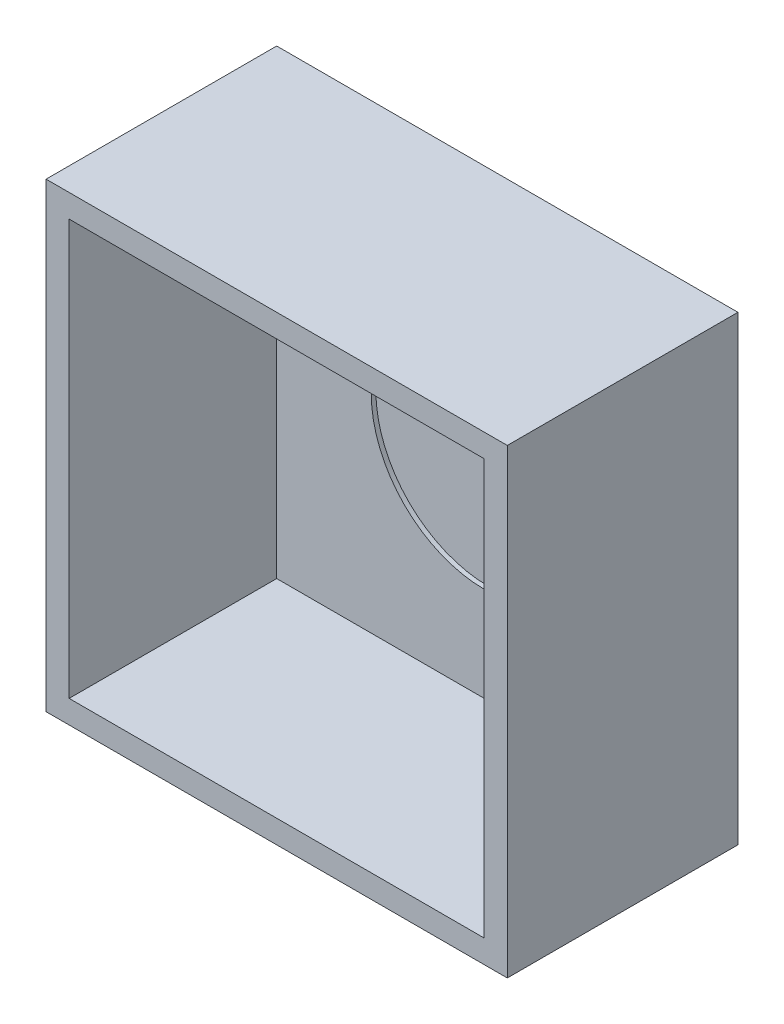
ISO-10303-21;
HEADER;
FILE_DESCRIPTION(('STEP AP214'),'2;1');
FILE_NAME('part.step','',(''),(''),'','','');
FILE_SCHEMA(('AUTOMOTIVE_DESIGN { 1 0 10303 214 1 1 1 1 }'));
ENDSEC;
DATA;
#1=APPLICATION_CONTEXT('core data for automotive mechanical design processes');
#2=APPLICATION_PROTOCOL_DEFINITION('international standard','automotive_design',2000,#1);
#3=PRODUCT_CONTEXT('',#1,'mechanical');
#4=PRODUCT('Part','Part','',(#3));
#5=PRODUCT_RELATED_PRODUCT_CATEGORY('part','',(#4));
#6=PRODUCT_DEFINITION_FORMATION('','',#4);
#7=PRODUCT_DEFINITION_CONTEXT('part definition',#1,'design');
#8=PRODUCT_DEFINITION('design','',#6,#7);
#9=PRODUCT_DEFINITION_SHAPE('','',#8);
#10=(LENGTH_UNIT() NAMED_UNIT(*) SI_UNIT(.MILLI.,.METRE.));
#11=(NAMED_UNIT(*) PLANE_ANGLE_UNIT() SI_UNIT($,.RADIAN.));
#12=(NAMED_UNIT(*) SI_UNIT($,.STERADIAN.) SOLID_ANGLE_UNIT());
#13=UNCERTAINTY_MEASURE_WITH_UNIT(LENGTH_MEASURE(1.E-05),#10,'distance_accuracy_value','');
#14=(GEOMETRIC_REPRESENTATION_CONTEXT(3) GLOBAL_UNCERTAINTY_ASSIGNED_CONTEXT((#13)) GLOBAL_UNIT_ASSIGNED_CONTEXT((#10,
#11,#12)) REPRESENTATION_CONTEXT('',''));
#15=CARTESIAN_POINT('',(0.,0.,0.));
#16=DIRECTION('',(0.,0.,1.));
#17=DIRECTION('',(1.,0.,0.));
#18=AXIS2_PLACEMENT_3D('',#15,#16,#17);
#19=CARTESIAN_POINT('',(0.,0.,10.));
#20=DIRECTION('',(0.,0.,-1.));
#21=DIRECTION('',(-1.,0.,0.));
#22=AXIS2_PLACEMENT_3D('',#19,#20,#21);
#23=PLANE('',#22);
#24=DIRECTION('',(0.,1.,0.));
#25=VECTOR('',#24,1.);
#26=CARTESIAN_POINT('',(10.,-10.,10.));
#27=LINE('',#26,#25);
#28=CARTESIAN_POINT('',(10.,-10.,10.));
#29=VERTEX_POINT('',#28);
#30=CARTESIAN_POINT('',(10.,10.,10.));
#31=VERTEX_POINT('',#30);
#32=EDGE_CURVE('E144',#29,#31,#27,.T.);
#33=ORIENTED_EDGE('',*,*,#32,.T.);
#34=DIRECTION('',(-1.,0.,0.));
#35=VECTOR('',#34,1.);
#36=CARTESIAN_POINT('',(-10.,10.,10.));
#37=LINE('',#36,#35);
#38=CARTESIAN_POINT('',(-10.,10.,10.));
#39=VERTEX_POINT('',#38);
#40=EDGE_CURVE('E88',#31,#39,#37,.T.);
#41=ORIENTED_EDGE('',*,*,#40,.T.);
#42=DIRECTION('',(0.,-1.,0.));
#43=VECTOR('',#42,1.);
#44=CARTESIAN_POINT('',(-10.,-10.,10.));
#45=LINE('',#44,#43);
#46=CARTESIAN_POINT('',(-10.,-10.,10.));
#47=VERTEX_POINT('',#46);
#48=EDGE_CURVE('E147',#39,#47,#45,.T.);
#49=ORIENTED_EDGE('',*,*,#48,.T.);
#50=DIRECTION('',(1.,0.,0.));
#51=VECTOR('',#50,1.);
#52=CARTESIAN_POINT('',(-10.,-10.,10.));
#53=LINE('',#52,#51);
#54=EDGE_CURVE('E60',#47,#29,#53,.T.);
#55=ORIENTED_EDGE('',*,*,#54,.T.);
#56=EDGE_LOOP('',(#33,#41,#49,#55));
#57=FACE_BOUND('',#56,.T.);
#58=DIRECTION('',(0.,1.,0.));
#59=VECTOR('',#58,1.);
#60=CARTESIAN_POINT('',(9.,0.,10.));
#61=LINE('',#60,#59);
#62=CARTESIAN_POINT('',(9.,-9.,10.));
#63=VERTEX_POINT('',#62);
#64=CARTESIAN_POINT('',(9.,9.,10.));
#65=VERTEX_POINT('',#64);
#66=EDGE_CURVE('E133',#63,#65,#61,.T.);
#67=ORIENTED_EDGE('',*,*,#66,.F.);
#68=DIRECTION('',(1.,0.,0.));
#69=VECTOR('',#68,1.);
#70=CARTESIAN_POINT('',(0.,-9.,10.));
#71=LINE('',#70,#69);
#72=CARTESIAN_POINT('',(-9.,-9.,10.));
#73=VERTEX_POINT('',#72);
#74=EDGE_CURVE('E142',#73,#63,#71,.T.);
#75=ORIENTED_EDGE('',*,*,#74,.F.);
#76=DIRECTION('',(0.,-1.,0.));
#77=VECTOR('',#76,1.);
#78=CARTESIAN_POINT('',(-9.,0.,10.));
#79=LINE('',#78,#77);
#80=CARTESIAN_POINT('',(-9.,9.,10.));
#81=VERTEX_POINT('',#80);
#82=EDGE_CURVE('E140',#81,#73,#79,.T.);
#83=ORIENTED_EDGE('',*,*,#82,.F.);
#84=DIRECTION('',(-1.,0.,0.));
#85=VECTOR('',#84,1.);
#86=CARTESIAN_POINT('',(0.,9.,10.));
#87=LINE('',#86,#85);
#88=EDGE_CURVE('E125',#65,#81,#87,.T.);
#89=ORIENTED_EDGE('',*,*,#88,.F.);
#90=EDGE_LOOP('',(#67,#75,#83,#89));
#91=FACE_BOUND('',#90,.T.);
#92=ADVANCED_FACE('F36',(#57,#91),#23,.F.);
#93=CARTESIAN_POINT('',(0.,0.,0.8));
#94=DIRECTION('',(0.,0.,1.));
#95=DIRECTION('',(1.,0.,0.));
#96=AXIS2_PLACEMENT_3D('',#93,#94,#95);
#97=PLANE('',#96);
#98=CARTESIAN_POINT('',(0.,0.,0.8));
#99=DIRECTION('',(0.,0.,1.));
#100=DIRECTION('',(1.,0.,0.));
#101=AXIS2_PLACEMENT_3D('',#98,#99,#100);
#102=CIRCLE('',#101,4.9);
#103=CARTESIAN_POINT('',(4.9,0.,0.8));
#104=VERTEX_POINT('',#103);
#105=EDGE_CURVE('E220',#104,#104,#102,.T.);
#106=ORIENTED_EDGE('',*,*,#105,.T.);
#107=EDGE_LOOP('',(#106));
#108=FACE_BOUND('',#107,.T.);
#109=ADVANCED_FACE('F183',(#108),#97,.T.);
#110=CARTESIAN_POINT('',(0.,0.,0.8));
#111=DIRECTION('',(0.,0.,1.));
#112=DIRECTION('',(1.,0.,0.));
#113=AXIS2_PLACEMENT_3D('',#110,#111,#112);
#114=CYLINDRICAL_SURFACE('',#113,4.9);
#115=ORIENTED_EDGE('',*,*,#105,.F.);
#116=EDGE_LOOP('',(#115));
#117=FACE_BOUND('',#116,.T.);
#118=CARTESIAN_POINT('',(0.,0.,1.));
#119=DIRECTION('',(0.,0.,1.));
#120=DIRECTION('',(1.,0.,0.));
#121=AXIS2_PLACEMENT_3D('',#118,#119,#120);
#122=CIRCLE('',#121,4.9);
#123=CARTESIAN_POINT('',(4.9,0.,1.));
#124=VERTEX_POINT('',#123);
#125=EDGE_CURVE('E218',#124,#124,#122,.T.);
#126=ORIENTED_EDGE('',*,*,#125,.T.);
#127=EDGE_LOOP('',(#126));
#128=FACE_BOUND('',#127,.T.);
#129=ADVANCED_FACE('F185',(#117,#128),#114,.F.);
#130=CARTESIAN_POINT('',(-10.,9.,10.));
#131=DIRECTION('',(0.,-1.,0.));
#132=DIRECTION('',(0.,0.,-1.));
#133=AXIS2_PLACEMENT_3D('',#130,#131,#132);
#134=PLANE('',#133);
#135=DIRECTION('',(-1.,0.,0.));
#136=VECTOR('',#135,1.);
#137=CARTESIAN_POINT('',(0.,9.,1.));
#138=LINE('',#137,#136);
#139=CARTESIAN_POINT('',(9.,9.,1.));
#140=VERTEX_POINT('',#139);
#141=CARTESIAN_POINT('',(-9.,9.,1.));
#142=VERTEX_POINT('',#141);
#143=EDGE_CURVE('E110',#140,#142,#138,.T.);
#144=ORIENTED_EDGE('',*,*,#143,.F.);
#145=DIRECTION('',(0.,0.,-1.));
#146=VECTOR('',#145,1.);
#147=CARTESIAN_POINT('',(9.,9.,10.));
#148=LINE('',#147,#146);
#149=EDGE_CURVE('E128',#65,#140,#148,.T.);
#150=ORIENTED_EDGE('',*,*,#149,.F.);
#151=ORIENTED_EDGE('',*,*,#88,.T.);
#152=DIRECTION('',(0.,0.,-1.));
#153=VECTOR('',#152,1.);
#154=CARTESIAN_POINT('',(-9.,9.,10.));
#155=LINE('',#154,#153);
#156=EDGE_CURVE('E122',#81,#142,#155,.T.);
#157=ORIENTED_EDGE('',*,*,#156,.T.);
#158=EDGE_LOOP('',(#144,#150,#151,#157));
#159=FACE_BOUND('',#158,.T.);
#160=ADVANCED_FACE('F123',(#159),#134,.T.);
#161=CARTESIAN_POINT('',(9.,-10.,10.));
#162=DIRECTION('',(-1.,0.,0.));
#163=DIRECTION('',(0.,0.,1.));
#164=AXIS2_PLACEMENT_3D('',#161,#162,#163);
#165=PLANE('',#164);
#166=DIRECTION('',(0.,1.,0.));
#167=VECTOR('',#166,1.);
#168=CARTESIAN_POINT('',(9.,0.,1.));
#169=LINE('',#168,#167);
#170=CARTESIAN_POINT('',(9.,-9.,1.));
#171=VERTEX_POINT('',#170);
#172=EDGE_CURVE('E116',#171,#140,#169,.T.);
#173=ORIENTED_EDGE('',*,*,#172,.F.);
#174=DIRECTION('',(0.,0.,-1.));
#175=VECTOR('',#174,1.);
#176=CARTESIAN_POINT('',(9.,-9.,10.));
#177=LINE('',#176,#175);
#178=EDGE_CURVE('E136',#63,#171,#177,.T.);
#179=ORIENTED_EDGE('',*,*,#178,.F.);
#180=ORIENTED_EDGE('',*,*,#66,.T.);
#181=ORIENTED_EDGE('',*,*,#149,.T.);
#182=EDGE_LOOP('',(#173,#179,#180,#181));
#183=FACE_BOUND('',#182,.T.);
#184=ADVANCED_FACE('F199',(#183),#165,.T.);
#185=CARTESIAN_POINT('',(-9.,-10.,10.));
#186=DIRECTION('',(1.,0.,0.));
#187=DIRECTION('',(0.,0.,-1.));
#188=AXIS2_PLACEMENT_3D('',#185,#186,#187);
#189=PLANE('',#188);
#190=DIRECTION('',(0.,-1.,0.));
#191=VECTOR('',#190,1.);
#192=CARTESIAN_POINT('',(-9.,0.,1.));
#193=LINE('',#192,#191);
#194=CARTESIAN_POINT('',(-9.,-9.,1.));
#195=VERTEX_POINT('',#194);
#196=EDGE_CURVE('E114',#142,#195,#193,.T.);
#197=ORIENTED_EDGE('',*,*,#196,.F.);
#198=ORIENTED_EDGE('',*,*,#156,.F.);
#199=ORIENTED_EDGE('',*,*,#82,.T.);
#200=DIRECTION('',(0.,0.,-1.));
#201=VECTOR('',#200,1.);
#202=CARTESIAN_POINT('',(-9.,-9.,10.));
#203=LINE('',#202,#201);
#204=EDGE_CURVE('E51',#73,#195,#203,.T.);
#205=ORIENTED_EDGE('',*,*,#204,.T.);
#206=EDGE_LOOP('',(#197,#198,#199,#205));
#207=FACE_BOUND('',#206,.T.);
#208=ADVANCED_FACE('F130',(#207),#189,.T.);
#209=CARTESIAN_POINT('',(0.,0.,1.));
#210=DIRECTION('',(0.,0.,-1.));
#211=DIRECTION('',(-1.,0.,0.));
#212=AXIS2_PLACEMENT_3D('',#209,#210,#211);
#213=PLANE('',#212);
#214=ORIENTED_EDGE('',*,*,#125,.F.);
#215=EDGE_LOOP('',(#214));
#216=FACE_BOUND('',#215,.T.);
#217=ORIENTED_EDGE('',*,*,#172,.T.);
#218=ORIENTED_EDGE('',*,*,#143,.T.);
#219=ORIENTED_EDGE('',*,*,#196,.T.);
#220=DIRECTION('',(1.,0.,0.));
#221=VECTOR('',#220,1.);
#222=CARTESIAN_POINT('',(0.,-9.,1.));
#223=LINE('',#222,#221);
#224=EDGE_CURVE('E131',#195,#171,#223,.T.);
#225=ORIENTED_EDGE('',*,*,#224,.T.);
#226=EDGE_LOOP('',(#217,#218,#219,#225));
#227=FACE_BOUND('',#226,.T.);
#228=ADVANCED_FACE('F112',(#216,#227),#213,.F.);
#229=CARTESIAN_POINT('',(-10.,-9.,10.));
#230=DIRECTION('',(0.,1.,0.));
#231=DIRECTION('',(0.,0.,1.));
#232=AXIS2_PLACEMENT_3D('',#229,#230,#231);
#233=PLANE('',#232);
#234=ORIENTED_EDGE('',*,*,#224,.F.);
#235=ORIENTED_EDGE('',*,*,#204,.F.);
#236=ORIENTED_EDGE('',*,*,#74,.T.);
#237=ORIENTED_EDGE('',*,*,#178,.T.);
#238=EDGE_LOOP('',(#234,#235,#236,#237));
#239=FACE_BOUND('',#238,.T.);
#240=ADVANCED_FACE('F196',(#239),#233,.T.);
#241=CARTESIAN_POINT('',(10.,-10.,10.));
#242=DIRECTION('',(-1.,0.,0.));
#243=DIRECTION('',(0.,0.,1.));
#244=AXIS2_PLACEMENT_3D('',#241,#242,#243);
#245=PLANE('',#244);
#246=DIRECTION('',(0.,1.,0.));
#247=VECTOR('',#246,1.);
#248=CARTESIAN_POINT('',(10.,-10.,0.));
#249=LINE('',#248,#247);
#250=CARTESIAN_POINT('',(10.,-10.,0.));
#251=VERTEX_POINT('',#250);
#252=CARTESIAN_POINT('',(10.,10.,0.));
#253=VERTEX_POINT('',#252);
#254=EDGE_CURVE('E151',#251,#253,#249,.T.);
#255=ORIENTED_EDGE('',*,*,#254,.T.);
#256=DIRECTION('',(0.,0.,-1.));
#257=VECTOR('',#256,1.);
#258=CARTESIAN_POINT('',(10.,10.,10.));
#259=LINE('',#258,#257);
#260=EDGE_CURVE('E11',#31,#253,#259,.T.);
#261=ORIENTED_EDGE('',*,*,#260,.F.);
#262=ORIENTED_EDGE('',*,*,#32,.F.);
#263=DIRECTION('',(0.,0.,-1.));
#264=VECTOR('',#263,1.);
#265=CARTESIAN_POINT('',(10.,-10.,10.));
#266=LINE('',#265,#264);
#267=EDGE_CURVE('E150',#29,#251,#266,.T.);
#268=ORIENTED_EDGE('',*,*,#267,.T.);
#269=EDGE_LOOP('',(#255,#261,#262,#268));
#270=FACE_BOUND('',#269,.T.);
#271=ADVANCED_FACE('F38',(#270),#245,.F.);
#272=CARTESIAN_POINT('',(-10.,10.,10.));
#273=DIRECTION('',(0.,-1.,0.));
#274=DIRECTION('',(0.,0.,-1.));
#275=AXIS2_PLACEMENT_3D('',#272,#273,#274);
#276=PLANE('',#275);
#277=DIRECTION('',(-1.,0.,0.));
#278=VECTOR('',#277,1.);
#279=CARTESIAN_POINT('',(-10.,10.,0.));
#280=LINE('',#279,#278);
#281=CARTESIAN_POINT('',(-10.,10.,0.));
#282=VERTEX_POINT('',#281);
#283=EDGE_CURVE('E154',#253,#282,#280,.T.);
#284=ORIENTED_EDGE('',*,*,#283,.T.);
#285=DIRECTION('',(0.,0.,-1.));
#286=VECTOR('',#285,1.);
#287=CARTESIAN_POINT('',(-10.,10.,10.));
#288=LINE('',#287,#286);
#289=EDGE_CURVE('E44',#39,#282,#288,.T.);
#290=ORIENTED_EDGE('',*,*,#289,.F.);
#291=ORIENTED_EDGE('',*,*,#40,.F.);
#292=ORIENTED_EDGE('',*,*,#260,.T.);
#293=EDGE_LOOP('',(#284,#290,#291,#292));
#294=FACE_BOUND('',#293,.T.);
#295=ADVANCED_FACE('F181',(#294),#276,.F.);
#296=CARTESIAN_POINT('',(-10.,-10.,10.));
#297=DIRECTION('',(1.,0.,0.));
#298=DIRECTION('',(0.,0.,-1.));
#299=AXIS2_PLACEMENT_3D('',#296,#297,#298);
#300=PLANE('',#299);
#301=DIRECTION('',(0.,-1.,0.));
#302=VECTOR('',#301,1.);
#303=CARTESIAN_POINT('',(-10.,-10.,0.));
#304=LINE('',#303,#302);
#305=CARTESIAN_POINT('',(-10.,-10.,0.));
#306=VERTEX_POINT('',#305);
#307=EDGE_CURVE('E156',#282,#306,#304,.T.);
#308=ORIENTED_EDGE('',*,*,#307,.T.);
#309=DIRECTION('',(0.,0.,-1.));
#310=VECTOR('',#309,1.);
#311=CARTESIAN_POINT('',(-10.,-10.,10.));
#312=LINE('',#311,#310);
#313=EDGE_CURVE('E160',#47,#306,#312,.T.);
#314=ORIENTED_EDGE('',*,*,#313,.F.);
#315=ORIENTED_EDGE('',*,*,#48,.F.);
#316=ORIENTED_EDGE('',*,*,#289,.T.);
#317=EDGE_LOOP('',(#308,#314,#315,#316));
#318=FACE_BOUND('',#317,.T.);
#319=ADVANCED_FACE('F165',(#318),#300,.F.);
#320=CARTESIAN_POINT('',(-10.,-10.,10.));
#321=DIRECTION('',(0.,1.,0.));
#322=DIRECTION('',(0.,0.,1.));
#323=AXIS2_PLACEMENT_3D('',#320,#321,#322);
#324=PLANE('',#323);
#325=DIRECTION('',(1.,0.,0.));
#326=VECTOR('',#325,1.);
#327=CARTESIAN_POINT('',(-10.,-10.,0.));
#328=LINE('',#327,#326);
#329=EDGE_CURVE('E81',#306,#251,#328,.T.);
#330=ORIENTED_EDGE('',*,*,#329,.T.);
#331=ORIENTED_EDGE('',*,*,#267,.F.);
#332=ORIENTED_EDGE('',*,*,#54,.F.);
#333=ORIENTED_EDGE('',*,*,#313,.T.);
#334=EDGE_LOOP('',(#330,#331,#332,#333));
#335=FACE_BOUND('',#334,.T.);
#336=ADVANCED_FACE('F173',(#335),#324,.F.);
#337=CARTESIAN_POINT('',(0.,0.,0.));
#338=DIRECTION('',(0.,0.,-1.));
#339=DIRECTION('',(-1.,0.,0.));
#340=AXIS2_PLACEMENT_3D('',#337,#338,#339);
#341=PLANE('',#340);
#342=ORIENTED_EDGE('',*,*,#254,.F.);
#343=ORIENTED_EDGE('',*,*,#329,.F.);
#344=ORIENTED_EDGE('',*,*,#307,.F.);
#345=ORIENTED_EDGE('',*,*,#283,.F.);
#346=EDGE_LOOP('',(#342,#343,#344,#345));
#347=FACE_BOUND('',#346,.T.);
#348=ADVANCED_FACE('F169',(#347),#341,.T.);
#349=CLOSED_SHELL('',(#92,#109,#129,#160,#184,#208,#228,#240,#271,#295,#319,#336,#348));
#350=MANIFOLD_SOLID_BREP('B2',#349);
#351=ADVANCED_BREP_SHAPE_REPRESENTATION('',(#18,#350),#14);
#352=SHAPE_DEFINITION_REPRESENTATION(#9,#351);
ENDSEC;
END-ISO-10303-21;
